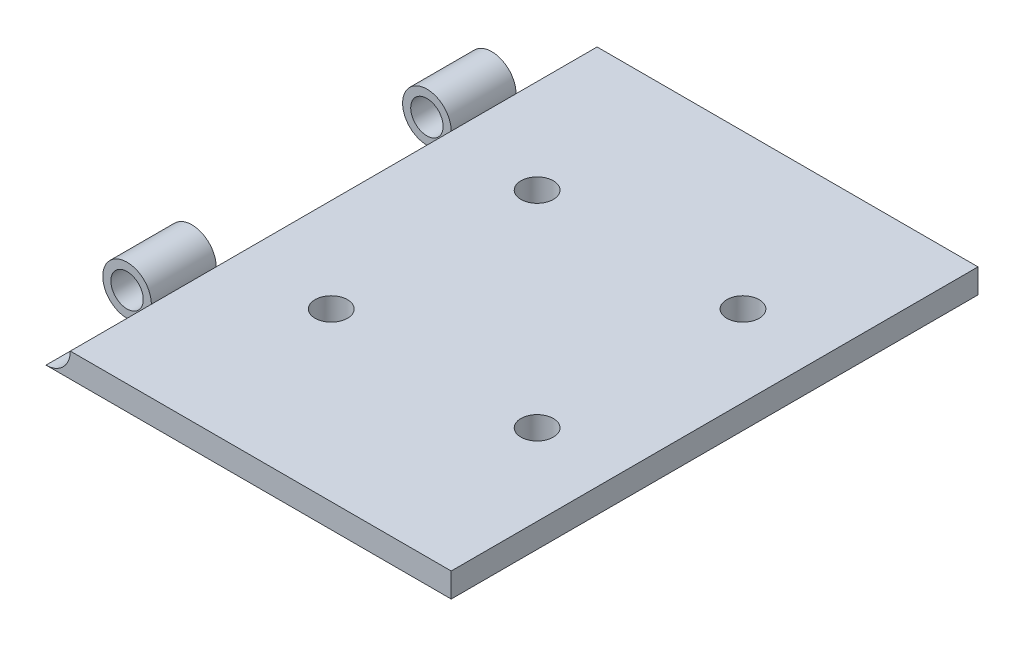
ISO-10303-21;
HEADER;
FILE_DESCRIPTION(('STEP AP214'),'2;1');
FILE_NAME('part.step','',(''),(''),'','','');
FILE_SCHEMA(('AUTOMOTIVE_DESIGN { 1 0 10303 214 1 1 1 1 }'));
ENDSEC;
DATA;
#1=APPLICATION_CONTEXT('core data for automotive mechanical design processes');
#2=APPLICATION_PROTOCOL_DEFINITION('international standard','automotive_design',2000,#1);
#3=PRODUCT_CONTEXT('',#1,'mechanical');
#4=PRODUCT('Part','Part','',(#3));
#5=PRODUCT_RELATED_PRODUCT_CATEGORY('part','',(#4));
#6=PRODUCT_DEFINITION_FORMATION('','',#4);
#7=PRODUCT_DEFINITION_CONTEXT('part definition',#1,'design');
#8=PRODUCT_DEFINITION('design','',#6,#7);
#9=PRODUCT_DEFINITION_SHAPE('','',#8);
#10=(LENGTH_UNIT() NAMED_UNIT(*) SI_UNIT(.MILLI.,.METRE.));
#11=(NAMED_UNIT(*) PLANE_ANGLE_UNIT() SI_UNIT($,.RADIAN.));
#12=(NAMED_UNIT(*) SI_UNIT($,.STERADIAN.) SOLID_ANGLE_UNIT());
#13=UNCERTAINTY_MEASURE_WITH_UNIT(LENGTH_MEASURE(1.E-05),#10,'distance_accuracy_value','');
#14=(GEOMETRIC_REPRESENTATION_CONTEXT(3) GLOBAL_UNCERTAINTY_ASSIGNED_CONTEXT((#13)) GLOBAL_UNIT_ASSIGNED_CONTEXT((#10,
#11,#12)) REPRESENTATION_CONTEXT('',''));
#15=CARTESIAN_POINT('',(0.,0.,0.));
#16=DIRECTION('',(0.,0.,1.));
#17=DIRECTION('',(1.,0.,0.));
#18=AXIS2_PLACEMENT_3D('',#15,#16,#17);
#19=CARTESIAN_POINT('',(-25.,3.,14.5));
#20=DIRECTION('',(0.,0.,1.));
#21=DIRECTION('',(1.,0.,0.));
#22=AXIS2_PLACEMENT_3D('',#19,#20,#21);
#23=CYLINDRICAL_SURFACE('',#22,3.);
#24=CARTESIAN_POINT('',(-25.,3.,14.5));
#25=DIRECTION('',(0.,0.,1.));
#26=DIRECTION('',(1.,0.,0.));
#27=AXIS2_PLACEMENT_3D('',#24,#25,#26);
#28=CIRCLE('',#27,3.);
#29=CARTESIAN_POINT('',(-22.,3.,14.5));
#30=VERTEX_POINT('',#29);
#31=EDGE_CURVE('E11',#30,#30,#28,.T.);
#32=ORIENTED_EDGE('',*,*,#31,.T.);
#33=EDGE_LOOP('',(#32));
#34=FACE_BOUND('',#33,.T.);
#35=CARTESIAN_POINT('',(-25.,3.,22.5));
#36=DIRECTION('',(0.,0.,1.));
#37=DIRECTION('',(1.,0.,0.));
#38=AXIS2_PLACEMENT_3D('',#35,#36,#37);
#39=CIRCLE('',#38,3.);
#40=CARTESIAN_POINT('',(-22.,3.,22.5));
#41=VERTEX_POINT('',#40);
#42=EDGE_CURVE('E44',#41,#41,#39,.T.);
#43=ORIENTED_EDGE('',*,*,#42,.F.);
#44=EDGE_LOOP('',(#43));
#45=FACE_BOUND('',#44,.T.);
#46=ADVANCED_FACE('F41',(#34,#45),#23,.T.);
#47=CARTESIAN_POINT('',(-25.,3.,14.5));
#48=DIRECTION('',(0.,0.,1.));
#49=DIRECTION('',(1.,0.,0.));
#50=AXIS2_PLACEMENT_3D('',#47,#48,#49);
#51=PLANE('',#50);
#52=CARTESIAN_POINT('',(-25.,3.,14.5));
#53=DIRECTION('',(0.,0.,1.));
#54=DIRECTION('',(1.,0.,0.));
#55=AXIS2_PLACEMENT_3D('',#52,#53,#54);
#56=CIRCLE('',#55,2.);
#57=CARTESIAN_POINT('',(-23.,3.,14.5));
#58=VERTEX_POINT('',#57);
#59=EDGE_CURVE('E51',#58,#58,#56,.T.);
#60=ORIENTED_EDGE('',*,*,#59,.T.);
#61=EDGE_LOOP('',(#60));
#62=FACE_BOUND('',#61,.T.);
#63=ORIENTED_EDGE('',*,*,#31,.F.);
#64=EDGE_LOOP('',(#63));
#65=FACE_BOUND('',#64,.T.);
#66=ADVANCED_FACE('F65',(#62,#65),#51,.F.);
#67=CARTESIAN_POINT('',(-25.,3.,22.5));
#68=DIRECTION('',(0.,0.,1.));
#69=DIRECTION('',(1.,0.,0.));
#70=AXIS2_PLACEMENT_3D('',#67,#68,#69);
#71=PLANE('',#70);
#72=CARTESIAN_POINT('',(-25.,3.,22.5));
#73=DIRECTION('',(0.,0.,1.));
#74=DIRECTION('',(1.,0.,0.));
#75=AXIS2_PLACEMENT_3D('',#72,#73,#74);
#76=CIRCLE('',#75,2.);
#77=CARTESIAN_POINT('',(-23.,3.,22.5));
#78=VERTEX_POINT('',#77);
#79=EDGE_CURVE('E55',#78,#78,#76,.T.);
#80=ORIENTED_EDGE('',*,*,#79,.F.);
#81=EDGE_LOOP('',(#80));
#82=FACE_BOUND('',#81,.T.);
#83=ORIENTED_EDGE('',*,*,#42,.T.);
#84=EDGE_LOOP('',(#83));
#85=FACE_BOUND('',#84,.T.);
#86=ADVANCED_FACE('F62',(#82,#85),#71,.T.);
#87=CARTESIAN_POINT('',(-25.,3.,-45.5));
#88=DIRECTION('',(0.,0.,1.));
#89=DIRECTION('',(1.,0.,0.));
#90=AXIS2_PLACEMENT_3D('',#87,#88,#89);
#91=CYLINDRICAL_SURFACE('',#90,2.);
#92=ORIENTED_EDGE('',*,*,#79,.T.);
#93=EDGE_LOOP('',(#92));
#94=FACE_BOUND('',#93,.T.);
#95=ORIENTED_EDGE('',*,*,#59,.F.);
#96=EDGE_LOOP('',(#95));
#97=FACE_BOUND('',#96,.T.);
#98=ADVANCED_FACE('F59',(#94,#97),#91,.F.);
#99=CLOSED_SHELL('',(#46,#66,#86,#98));
#100=MANIFOLD_SOLID_BREP('B2',#99);
#101=CARTESIAN_POINT('',(-25.,3.,-37.5));
#102=DIRECTION('',(0.,0.,1.));
#103=DIRECTION('',(1.,0.,0.));
#104=AXIS2_PLACEMENT_3D('',#101,#102,#103);
#105=CYLINDRICAL_SURFACE('',#104,3.);
#106=CARTESIAN_POINT('',(-25.,3.,-14.5));
#107=DIRECTION('',(0.,0.,-1.));
#108=DIRECTION('',(-1.,0.,0.));
#109=AXIS2_PLACEMENT_3D('',#106,#107,#108);
#110=CIRCLE('',#109,3.);
#111=CARTESIAN_POINT('',(-22.,3.,-14.5));
#112=VERTEX_POINT('',#111);
#113=CARTESIAN_POINT('',(-25.,0.,-14.5));
#114=VERTEX_POINT('',#113);
#115=EDGE_CURVE('E211',#112,#114,#110,.T.);
#116=ORIENTED_EDGE('',*,*,#115,.T.);
#117=DIRECTION('',(0.,0.,1.));
#118=VECTOR('',#117,1.);
#119=CARTESIAN_POINT('',(-25.,0.,32.5));
#120=LINE('',#119,#118);
#121=CARTESIAN_POINT('',(-25.,0.,32.5));
#122=VERTEX_POINT('',#121);
#123=EDGE_CURVE('E169',#114,#122,#120,.T.);
#124=ORIENTED_EDGE('',*,*,#123,.T.);
#125=CARTESIAN_POINT('',(-25.,3.,32.5));
#126=DIRECTION('',(0.,0.,1.));
#127=DIRECTION('',(1.,0.,0.));
#128=AXIS2_PLACEMENT_3D('',#125,#126,#127);
#129=CIRCLE('',#128,3.);
#130=CARTESIAN_POINT('',(-22.,3.,32.5));
#131=VERTEX_POINT('',#130);
#132=EDGE_CURVE('E151',#122,#131,#129,.T.);
#133=ORIENTED_EDGE('',*,*,#132,.T.);
#134=DIRECTION('',(0.,0.,1.));
#135=VECTOR('',#134,1.);
#136=CARTESIAN_POINT('',(-22.,3.,-37.5));
#137=LINE('',#136,#135);
#138=EDGE_CURVE('E174',#112,#131,#137,.T.);
#139=ORIENTED_EDGE('',*,*,#138,.F.);
#140=EDGE_LOOP('',(#116,#124,#133,#139));
#141=FACE_BOUND('',#140,.T.);
#142=ADVANCED_FACE('F103',(#141),#105,.F.);
#143=CARTESIAN_POINT('',(25.,3.,32.5));
#144=DIRECTION('',(-1.,0.,0.));
#145=DIRECTION('',(0.,0.,1.));
#146=AXIS2_PLACEMENT_3D('',#143,#144,#145);
#147=PLANE('',#146);
#148=DIRECTION('',(0.,0.,-1.));
#149=VECTOR('',#148,1.);
#150=CARTESIAN_POINT('',(25.,0.,32.5));
#151=LINE('',#150,#149);
#152=CARTESIAN_POINT('',(25.,0.,32.5));
#153=VERTEX_POINT('',#152);
#154=CARTESIAN_POINT('',(25.,0.,-32.5));
#155=VERTEX_POINT('',#154);
#156=EDGE_CURVE('E161',#153,#155,#151,.T.);
#157=ORIENTED_EDGE('',*,*,#156,.T.);
#158=DIRECTION('',(0.,-1.,0.));
#159=VECTOR('',#158,1.);
#160=CARTESIAN_POINT('',(25.,3.,-32.5));
#161=LINE('',#160,#159);
#162=CARTESIAN_POINT('',(25.,3.,-32.5));
#163=VERTEX_POINT('',#162);
#164=EDGE_CURVE('E39',#163,#155,#161,.T.);
#165=ORIENTED_EDGE('',*,*,#164,.F.);
#166=DIRECTION('',(0.,0.,-1.));
#167=VECTOR('',#166,1.);
#168=CARTESIAN_POINT('',(25.,3.,32.5));
#169=LINE('',#168,#167);
#170=CARTESIAN_POINT('',(25.,3.,32.5));
#171=VERTEX_POINT('',#170);
#172=EDGE_CURVE('E155',#171,#163,#169,.T.);
#173=ORIENTED_EDGE('',*,*,#172,.F.);
#174=DIRECTION('',(0.,-1.,0.));
#175=VECTOR('',#174,1.);
#176=CARTESIAN_POINT('',(25.,3.,32.5));
#177=LINE('',#176,#175);
#178=EDGE_CURVE('E112',#171,#153,#177,.T.);
#179=ORIENTED_EDGE('',*,*,#178,.T.);
#180=EDGE_LOOP('',(#157,#165,#173,#179));
#181=FACE_BOUND('',#180,.T.);
#182=ADVANCED_FACE('F105',(#181),#147,.F.);
#183=CARTESIAN_POINT('',(-25.,3.,-32.5));
#184=DIRECTION('',(0.,0.,1.));
#185=DIRECTION('',(1.,0.,0.));
#186=AXIS2_PLACEMENT_3D('',#183,#184,#185);
#187=PLANE('',#186);
#188=DIRECTION('',(-1.,0.,0.));
#189=VECTOR('',#188,1.);
#190=CARTESIAN_POINT('',(-25.,0.,-32.5));
#191=LINE('',#190,#189);
#192=CARTESIAN_POINT('',(-25.,0.,-32.5));
#193=VERTEX_POINT('',#192);
#194=EDGE_CURVE('E166',#155,#193,#191,.T.);
#195=ORIENTED_EDGE('',*,*,#194,.T.);
#196=CARTESIAN_POINT('',(-25.,3.,-32.5));
#197=DIRECTION('',(0.,0.,1.));
#198=DIRECTION('',(1.,0.,0.));
#199=AXIS2_PLACEMENT_3D('',#196,#197,#198);
#200=CIRCLE('',#199,3.);
#201=CARTESIAN_POINT('',(-22.,3.,-32.5));
#202=VERTEX_POINT('',#201);
#203=EDGE_CURVE('E218',#193,#202,#200,.T.);
#204=ORIENTED_EDGE('',*,*,#203,.T.);
#205=DIRECTION('',(-1.,0.,0.));
#206=VECTOR('',#205,1.);
#207=CARTESIAN_POINT('',(-25.,3.,-32.5));
#208=LINE('',#207,#206);
#209=EDGE_CURVE('E221',#163,#202,#208,.T.);
#210=ORIENTED_EDGE('',*,*,#209,.F.);
#211=ORIENTED_EDGE('',*,*,#164,.T.);
#212=EDGE_LOOP('',(#195,#204,#210,#211));
#213=FACE_BOUND('',#212,.T.);
#214=ADVANCED_FACE('F227',(#213),#187,.F.);
#215=CARTESIAN_POINT('',(-25.,3.,32.5));
#216=DIRECTION('',(0.,0.,-1.));
#217=DIRECTION('',(-1.,0.,0.));
#218=AXIS2_PLACEMENT_3D('',#215,#216,#217);
#219=PLANE('',#218);
#220=DIRECTION('',(1.,0.,0.));
#221=VECTOR('',#220,1.);
#222=CARTESIAN_POINT('',(-25.,3.,32.5));
#223=LINE('',#222,#221);
#224=EDGE_CURVE('E128',#131,#171,#223,.T.);
#225=ORIENTED_EDGE('',*,*,#224,.F.);
#226=ORIENTED_EDGE('',*,*,#132,.F.);
#227=DIRECTION('',(1.,0.,0.));
#228=VECTOR('',#227,1.);
#229=CARTESIAN_POINT('',(-25.,0.,32.5));
#230=LINE('',#229,#228);
#231=EDGE_CURVE('E145',#122,#153,#230,.T.);
#232=ORIENTED_EDGE('',*,*,#231,.T.);
#233=ORIENTED_EDGE('',*,*,#178,.F.);
#234=EDGE_LOOP('',(#225,#226,#232,#233));
#235=FACE_BOUND('',#234,.T.);
#236=ADVANCED_FACE('F147',(#235),#219,.F.);
#237=CARTESIAN_POINT('',(0.,3.,0.));
#238=DIRECTION('',(0.,-1.,0.));
#239=DIRECTION('',(0.,0.,-1.));
#240=AXIS2_PLACEMENT_3D('',#237,#238,#239);
#241=PLANE('',#240);
#242=CARTESIAN_POINT('',(-10.3999999999997,3.,11.9));
#243=DIRECTION('',(0.,1.,0.));
#244=DIRECTION('',(0.,0.,1.));
#245=AXIS2_PLACEMENT_3D('',#242,#243,#244);
#246=CIRCLE('',#245,2.);
#247=CARTESIAN_POINT('',(-10.3999999999997,3.,13.9));
#248=VERTEX_POINT('',#247);
#249=EDGE_CURVE('E204',#248,#248,#246,.T.);
#250=ORIENTED_EDGE('',*,*,#249,.F.);
#251=EDGE_LOOP('',(#250));
#252=FACE_BOUND('',#251,.T.);
#253=CARTESIAN_POINT('',(15.0000000000003,3.,11.9));
#254=DIRECTION('',(0.,1.,0.));
#255=DIRECTION('',(0.,0.,1.));
#256=AXIS2_PLACEMENT_3D('',#253,#254,#255);
#257=CIRCLE('',#256,2.);
#258=CARTESIAN_POINT('',(15.0000000000003,3.,13.9));
#259=VERTEX_POINT('',#258);
#260=EDGE_CURVE('E194',#259,#259,#257,.T.);
#261=ORIENTED_EDGE('',*,*,#260,.F.);
#262=EDGE_LOOP('',(#261));
#263=FACE_BOUND('',#262,.T.);
#264=CARTESIAN_POINT('',(15.,3.,-13.5));
#265=DIRECTION('',(0.,1.,0.));
#266=DIRECTION('',(0.,0.,1.));
#267=AXIS2_PLACEMENT_3D('',#264,#265,#266);
#268=CIRCLE('',#267,2.);
#269=CARTESIAN_POINT('',(15.,3.,-11.5));
#270=VERTEX_POINT('',#269);
#271=EDGE_CURVE('E191',#270,#270,#268,.T.);
#272=ORIENTED_EDGE('',*,*,#271,.F.);
#273=EDGE_LOOP('',(#272));
#274=FACE_BOUND('',#273,.T.);
#275=CARTESIAN_POINT('',(-10.4,3.,-13.5));
#276=DIRECTION('',(0.,1.,0.));
#277=DIRECTION('',(0.,0.,1.));
#278=AXIS2_PLACEMENT_3D('',#275,#276,#277);
#279=CIRCLE('',#278,2.);
#280=CARTESIAN_POINT('',(-10.4,3.,-11.5));
#281=VERTEX_POINT('',#280);
#282=EDGE_CURVE('E188',#281,#281,#279,.T.);
#283=ORIENTED_EDGE('',*,*,#282,.F.);
#284=EDGE_LOOP('',(#283));
#285=FACE_BOUND('',#284,.T.);
#286=ORIENTED_EDGE('',*,*,#209,.T.);
#287=CARTESIAN_POINT('',(-22.,3.,-22.5));
#288=VERTEX_POINT('',#287);
#289=EDGE_CURVE('E167',#202,#288,#137,.T.);
#290=ORIENTED_EDGE('',*,*,#289,.T.);
#291=EDGE_CURVE('E172',#288,#112,#137,.T.);
#292=ORIENTED_EDGE('',*,*,#291,.T.);
#293=ORIENTED_EDGE('',*,*,#138,.T.);
#294=ORIENTED_EDGE('',*,*,#224,.T.);
#295=ORIENTED_EDGE('',*,*,#172,.T.);
#296=EDGE_LOOP('',(#286,#290,#292,#293,#294,#295));
#297=FACE_BOUND('',#296,.T.);
#298=ADVANCED_FACE('F223',(#252,#263,#274,#285,#297),#241,.F.);
#299=CARTESIAN_POINT('',(0.,0.,0.));
#300=DIRECTION('',(0.,-1.,0.));
#301=DIRECTION('',(0.,0.,-1.));
#302=AXIS2_PLACEMENT_3D('',#299,#300,#301);
#303=PLANE('',#302);
#304=CARTESIAN_POINT('',(-10.3999999999997,0.,11.9));
#305=DIRECTION('',(0.,-1.,0.));
#306=DIRECTION('',(0.,0.,-1.));
#307=AXIS2_PLACEMENT_3D('',#304,#305,#306);
#308=CIRCLE('',#307,2.);
#309=CARTESIAN_POINT('',(-10.3999999999997,0.,9.90000000000001));
#310=VERTEX_POINT('',#309);
#311=EDGE_CURVE('E107',#310,#310,#308,.T.);
#312=ORIENTED_EDGE('',*,*,#311,.F.);
#313=EDGE_LOOP('',(#312));
#314=FACE_BOUND('',#313,.T.);
#315=CARTESIAN_POINT('',(15.0000000000003,0.,11.9));
#316=DIRECTION('',(0.,-1.,0.));
#317=DIRECTION('',(0.,0.,-1.));
#318=AXIS2_PLACEMENT_3D('',#315,#316,#317);
#319=CIRCLE('',#318,2.);
#320=CARTESIAN_POINT('',(15.0000000000003,0.,9.90000000000001));
#321=VERTEX_POINT('',#320);
#322=EDGE_CURVE('E192',#321,#321,#319,.T.);
#323=ORIENTED_EDGE('',*,*,#322,.F.);
#324=EDGE_LOOP('',(#323));
#325=FACE_BOUND('',#324,.T.);
#326=CARTESIAN_POINT('',(15.,0.,-13.5));
#327=DIRECTION('',(0.,-1.,0.));
#328=DIRECTION('',(0.,0.,-1.));
#329=AXIS2_PLACEMENT_3D('',#326,#327,#328);
#330=CIRCLE('',#329,2.);
#331=CARTESIAN_POINT('',(15.,0.,-15.5));
#332=VERTEX_POINT('',#331);
#333=EDGE_CURVE('E189',#332,#332,#330,.T.);
#334=ORIENTED_EDGE('',*,*,#333,.F.);
#335=EDGE_LOOP('',(#334));
#336=FACE_BOUND('',#335,.T.);
#337=CARTESIAN_POINT('',(-10.4,0.,-13.5));
#338=DIRECTION('',(0.,-1.,0.));
#339=DIRECTION('',(0.,0.,-1.));
#340=AXIS2_PLACEMENT_3D('',#337,#338,#339);
#341=CIRCLE('',#340,2.);
#342=CARTESIAN_POINT('',(-10.4,0.,-15.5));
#343=VERTEX_POINT('',#342);
#344=EDGE_CURVE('E185',#343,#343,#341,.T.);
#345=ORIENTED_EDGE('',*,*,#344,.F.);
#346=EDGE_LOOP('',(#345));
#347=FACE_BOUND('',#346,.T.);
#348=ORIENTED_EDGE('',*,*,#156,.F.);
#349=ORIENTED_EDGE('',*,*,#231,.F.);
#350=ORIENTED_EDGE('',*,*,#123,.F.);
#351=CARTESIAN_POINT('',(-25.,0.,-22.5));
#352=VERTEX_POINT('',#351);
#353=EDGE_CURVE('E179',#352,#114,#120,.T.);
#354=ORIENTED_EDGE('',*,*,#353,.F.);
#355=EDGE_CURVE('E156',#193,#352,#120,.T.);
#356=ORIENTED_EDGE('',*,*,#355,.F.);
#357=ORIENTED_EDGE('',*,*,#194,.F.);
#358=EDGE_LOOP('',(#348,#349,#350,#354,#356,#357));
#359=FACE_BOUND('',#358,.T.);
#360=ADVANCED_FACE('F163',(#314,#325,#336,#347,#359),#303,.T.);
#361=ORIENTED_EDGE('',*,*,#355,.T.);
#362=CARTESIAN_POINT('',(-25.,3.,-22.5));
#363=DIRECTION('',(0.,0.,-1.));
#364=DIRECTION('',(-1.,0.,0.));
#365=AXIS2_PLACEMENT_3D('',#362,#363,#364);
#366=CIRCLE('',#365,3.);
#367=EDGE_CURVE('E215',#288,#352,#366,.T.);
#368=ORIENTED_EDGE('',*,*,#367,.F.);
#369=ORIENTED_EDGE('',*,*,#289,.F.);
#370=ORIENTED_EDGE('',*,*,#203,.F.);
#371=EDGE_LOOP('',(#361,#368,#369,#370));
#372=FACE_BOUND('',#371,.T.);
#373=ADVANCED_FACE('F229',(#372),#105,.F.);
#374=CARTESIAN_POINT('',(-25.,3.,-14.5));
#375=DIRECTION('',(0.,0.,-1.));
#376=DIRECTION('',(-1.,0.,0.));
#377=AXIS2_PLACEMENT_3D('',#374,#375,#376);
#378=CYLINDRICAL_SURFACE('',#377,3.);
#379=ORIENTED_EDGE('',*,*,#291,.F.);
#380=EDGE_CURVE('E119',#352,#288,#366,.T.);
#381=ORIENTED_EDGE('',*,*,#380,.F.);
#382=ORIENTED_EDGE('',*,*,#353,.T.);
#383=EDGE_CURVE('E214',#114,#112,#110,.T.);
#384=ORIENTED_EDGE('',*,*,#383,.T.);
#385=EDGE_LOOP('',(#379,#381,#382,#384));
#386=FACE_BOUND('',#385,.T.);
#387=ADVANCED_FACE('F250',(#386),#378,.T.);
#388=CARTESIAN_POINT('',(-25.,3.,-14.5));
#389=DIRECTION('',(0.,0.,-1.));
#390=DIRECTION('',(-1.,0.,0.));
#391=AXIS2_PLACEMENT_3D('',#388,#389,#390);
#392=PLANE('',#391);
#393=CARTESIAN_POINT('',(-25.,3.,-14.5));
#394=DIRECTION('',(0.,0.,-1.));
#395=DIRECTION('',(-1.,0.,0.));
#396=AXIS2_PLACEMENT_3D('',#393,#394,#395);
#397=CIRCLE('',#396,2.);
#398=CARTESIAN_POINT('',(-27.,3.,-14.5));
#399=VERTEX_POINT('',#398);
#400=EDGE_CURVE('E184',#399,#399,#397,.T.);
#401=ORIENTED_EDGE('',*,*,#400,.T.);
#402=EDGE_LOOP('',(#401));
#403=FACE_BOUND('',#402,.T.);
#404=ORIENTED_EDGE('',*,*,#115,.F.);
#405=ORIENTED_EDGE('',*,*,#383,.F.);
#406=EDGE_LOOP('',(#404,#405));
#407=FACE_BOUND('',#406,.T.);
#408=ADVANCED_FACE('F252',(#403,#407),#392,.F.);
#409=CARTESIAN_POINT('',(-25.,3.,-22.5));
#410=DIRECTION('',(0.,0.,-1.));
#411=DIRECTION('',(-1.,0.,0.));
#412=AXIS2_PLACEMENT_3D('',#409,#410,#411);
#413=PLANE('',#412);
#414=CARTESIAN_POINT('',(-25.,3.,-22.5));
#415=DIRECTION('',(0.,0.,-1.));
#416=DIRECTION('',(-1.,0.,0.));
#417=AXIS2_PLACEMENT_3D('',#414,#415,#416);
#418=CIRCLE('',#417,2.);
#419=CARTESIAN_POINT('',(-27.,3.,-22.5));
#420=VERTEX_POINT('',#419);
#421=EDGE_CURVE('E181',#420,#420,#418,.T.);
#422=ORIENTED_EDGE('',*,*,#421,.F.);
#423=EDGE_LOOP('',(#422));
#424=FACE_BOUND('',#423,.T.);
#425=ORIENTED_EDGE('',*,*,#367,.T.);
#426=ORIENTED_EDGE('',*,*,#380,.T.);
#427=EDGE_LOOP('',(#425,#426));
#428=FACE_BOUND('',#427,.T.);
#429=ADVANCED_FACE('F233',(#424,#428),#413,.T.);
#430=CARTESIAN_POINT('',(-25.,3.,-45.5));
#431=DIRECTION('',(0.,0.,1.));
#432=DIRECTION('',(1.,0.,0.));
#433=AXIS2_PLACEMENT_3D('',#430,#431,#432);
#434=CYLINDRICAL_SURFACE('',#433,2.);
#435=ORIENTED_EDGE('',*,*,#421,.T.);
#436=EDGE_LOOP('',(#435));
#437=FACE_BOUND('',#436,.T.);
#438=ORIENTED_EDGE('',*,*,#400,.F.);
#439=EDGE_LOOP('',(#438));
#440=FACE_BOUND('',#439,.T.);
#441=ADVANCED_FACE('F260',(#437,#440),#434,.F.);
#442=CARTESIAN_POINT('',(-10.4,-35.,-13.5));
#443=DIRECTION('',(0.,1.,0.));
#444=DIRECTION('',(0.,0.,1.));
#445=AXIS2_PLACEMENT_3D('',#442,#443,#444);
#446=CYLINDRICAL_SURFACE('',#445,2.);
#447=ORIENTED_EDGE('',*,*,#344,.T.);
#448=EDGE_LOOP('',(#447));
#449=FACE_BOUND('',#448,.T.);
#450=ORIENTED_EDGE('',*,*,#282,.T.);
#451=EDGE_LOOP('',(#450));
#452=FACE_BOUND('',#451,.T.);
#453=ADVANCED_FACE('F313',(#449,#452),#446,.F.);
#454=CARTESIAN_POINT('',(15.,-35.,-13.5));
#455=DIRECTION('',(0.,1.,0.));
#456=DIRECTION('',(0.,0.,1.));
#457=AXIS2_PLACEMENT_3D('',#454,#455,#456);
#458=CYLINDRICAL_SURFACE('',#457,2.);
#459=ORIENTED_EDGE('',*,*,#333,.T.);
#460=EDGE_LOOP('',(#459));
#461=FACE_BOUND('',#460,.T.);
#462=ORIENTED_EDGE('',*,*,#271,.T.);
#463=EDGE_LOOP('',(#462));
#464=FACE_BOUND('',#463,.T.);
#465=ADVANCED_FACE('F318',(#461,#464),#458,.F.);
#466=CARTESIAN_POINT('',(15.0000000000003,-35.,11.9));
#467=DIRECTION('',(0.,1.,0.));
#468=DIRECTION('',(0.,0.,1.));
#469=AXIS2_PLACEMENT_3D('',#466,#467,#468);
#470=CYLINDRICAL_SURFACE('',#469,2.);
#471=ORIENTED_EDGE('',*,*,#322,.T.);
#472=EDGE_LOOP('',(#471));
#473=FACE_BOUND('',#472,.T.);
#474=ORIENTED_EDGE('',*,*,#260,.T.);
#475=EDGE_LOOP('',(#474));
#476=FACE_BOUND('',#475,.T.);
#477=ADVANCED_FACE('F328',(#473,#476),#470,.F.);
#478=CARTESIAN_POINT('',(-10.3999999999997,-35.,11.9));
#479=DIRECTION('',(0.,1.,0.));
#480=DIRECTION('',(0.,0.,1.));
#481=AXIS2_PLACEMENT_3D('',#478,#479,#480);
#482=CYLINDRICAL_SURFACE('',#481,2.);
#483=ORIENTED_EDGE('',*,*,#311,.T.);
#484=EDGE_LOOP('',(#483));
#485=FACE_BOUND('',#484,.T.);
#486=ORIENTED_EDGE('',*,*,#249,.T.);
#487=EDGE_LOOP('',(#486));
#488=FACE_BOUND('',#487,.T.);
#489=ADVANCED_FACE('F338',(#485,#488),#482,.F.);
#490=CLOSED_SHELL('',(#142,#182,#214,#236,#298,#360,#373,#387,#408,#429,#441,#453,#465,#477,#489));
#491=MANIFOLD_SOLID_BREP('B6',#490);
#492=ADVANCED_BREP_SHAPE_REPRESENTATION('',(#18,#100,#491),#14);
#493=SHAPE_DEFINITION_REPRESENTATION(#9,#492);
ENDSEC;
END-ISO-10303-21;
